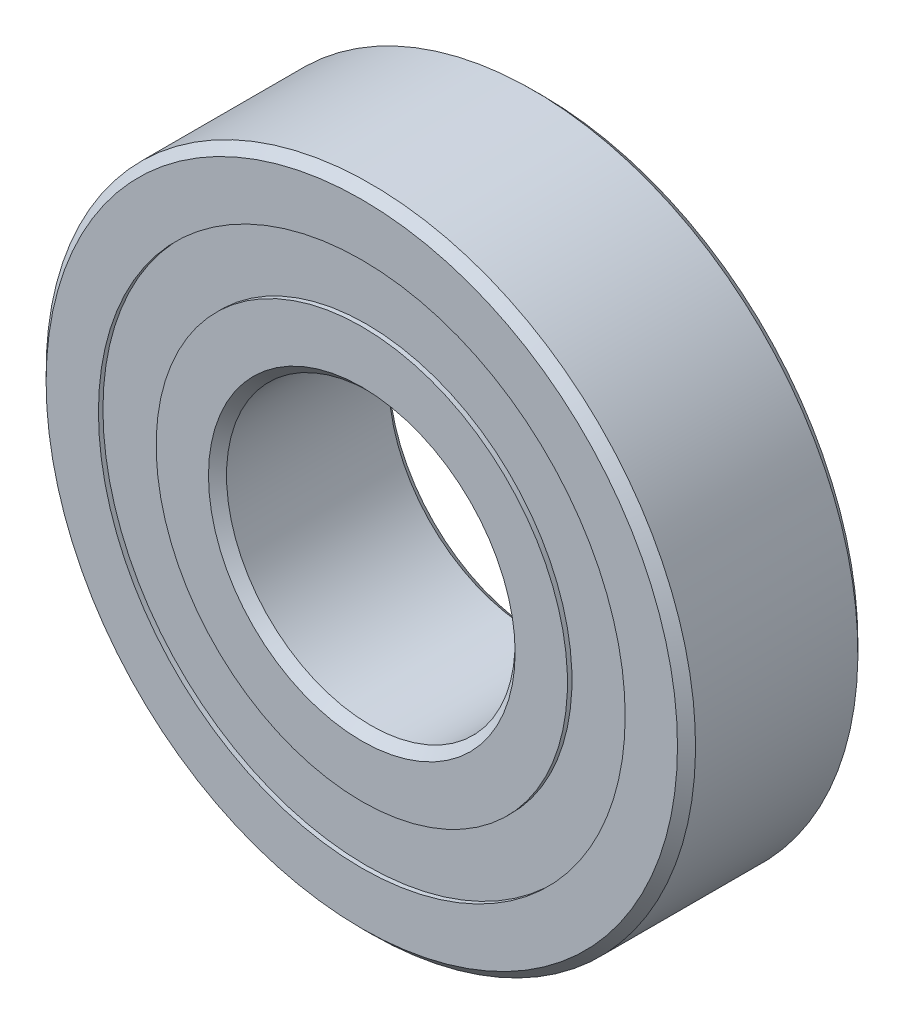
ISO-10303-21;
HEADER;
FILE_DESCRIPTION(('STEP AP214'),'2;1');
FILE_NAME('part.step','',(''),(''),'','','');
FILE_SCHEMA(('AUTOMOTIVE_DESIGN { 1 0 10303 214 1 1 1 1 }'));
ENDSEC;
DATA;
#1=APPLICATION_CONTEXT('core data for automotive mechanical design processes');
#2=APPLICATION_PROTOCOL_DEFINITION('international standard','automotive_design',2000,#1);
#3=PRODUCT_CONTEXT('',#1,'mechanical');
#4=PRODUCT('Part','Part','',(#3));
#5=PRODUCT_RELATED_PRODUCT_CATEGORY('part','',(#4));
#6=PRODUCT_DEFINITION_FORMATION('','',#4);
#7=PRODUCT_DEFINITION_CONTEXT('part definition',#1,'design');
#8=PRODUCT_DEFINITION('design','',#6,#7);
#9=PRODUCT_DEFINITION_SHAPE('','',#8);
#10=(LENGTH_UNIT() NAMED_UNIT(*) SI_UNIT(.MILLI.,.METRE.));
#11=(NAMED_UNIT(*) PLANE_ANGLE_UNIT() SI_UNIT($,.RADIAN.));
#12=(NAMED_UNIT(*) SI_UNIT($,.STERADIAN.) SOLID_ANGLE_UNIT());
#13=UNCERTAINTY_MEASURE_WITH_UNIT(LENGTH_MEASURE(1.E-05),#10,'distance_accuracy_value','');
#14=(GEOMETRIC_REPRESENTATION_CONTEXT(3) GLOBAL_UNCERTAINTY_ASSIGNED_CONTEXT((#13)) GLOBAL_UNIT_ASSIGNED_CONTEXT((#10,
#11,#12)) REPRESENTATION_CONTEXT('',''));
#15=CARTESIAN_POINT('',(0.,0.,0.));
#16=DIRECTION('',(0.,0.,1.));
#17=DIRECTION('',(1.,0.,0.));
#18=AXIS2_PLACEMENT_3D('',#15,#16,#17);
#19=CARTESIAN_POINT('',(0.,11.58875,-3.7703125));
#20=DIRECTION('',(0.,0.,1.));
#21=DIRECTION('',(0.,-1.,0.));
#22=AXIS2_PLACEMENT_3D('',#19,#20,#21);
#23=PLANE('',#22);
#24=CARTESIAN_POINT('',(0.,0.,-3.7703125));
#25=DIRECTION('',(0.,0.,1.));
#26=DIRECTION('',(0.,-1.,0.));
#27=AXIS2_PLACEMENT_3D('',#24,#25,#26);
#28=CIRCLE('',#27,11.58875);
#29=CARTESIAN_POINT('',(0.,-11.58875,-3.7703125));
#30=VERTEX_POINT('',#29);
#31=EDGE_CURVE('E69',#30,#30,#28,.T.);
#32=ORIENTED_EDGE('',*,*,#31,.F.);
#33=EDGE_LOOP('',(#32));
#34=FACE_BOUND('',#33,.T.);
#35=CARTESIAN_POINT('',(0.,0.,-3.7703125));
#36=DIRECTION('',(0.,0.,1.));
#37=DIRECTION('',(0.,-1.,0.));
#38=AXIS2_PLACEMENT_3D('',#35,#36,#37);
#39=CIRCLE('',#38,9.04875);
#40=CARTESIAN_POINT('',(0.,-9.04875,-3.7703125));
#41=VERTEX_POINT('',#40);
#42=EDGE_CURVE('E11',#41,#41,#39,.T.);
#43=ORIENTED_EDGE('',*,*,#42,.T.);
#44=EDGE_LOOP('',(#43));
#45=FACE_BOUND('',#44,.T.);
#46=ADVANCED_FACE('F50',(#34,#45),#23,.F.);
#47=CARTESIAN_POINT('',(0.,0.,3.96875));
#48=DIRECTION('',(0.,0.,1.));
#49=DIRECTION('',(0.,-1.,0.));
#50=AXIS2_PLACEMENT_3D('',#47,#48,#49);
#51=CYLINDRICAL_SURFACE('',#50,9.04875);
#52=ORIENTED_EDGE('',*,*,#42,.F.);
#53=EDGE_LOOP('',(#52));
#54=FACE_BOUND('',#53,.T.);
#55=CARTESIAN_POINT('',(0.,0.,-2.1735234096613));
#56=DIRECTION('',(0.,0.,1.));
#57=DIRECTION('',(0.,-1.,0.));
#58=AXIS2_PLACEMENT_3D('',#55,#56,#57);
#59=CIRCLE('',#58,9.04875);
#60=CARTESIAN_POINT('',(0.,-9.04875,-2.1735234096613));
#61=VERTEX_POINT('',#60);
#62=EDGE_CURVE('E57',#61,#61,#59,.T.);
#63=ORIENTED_EDGE('',*,*,#62,.T.);
#64=EDGE_LOOP('',(#63));
#65=FACE_BOUND('',#64,.T.);
#66=ADVANCED_FACE('F80',(#54,#65),#51,.F.);
#67=CARTESIAN_POINT('',(0.,11.58875,-2.1735234096613));
#68=DIRECTION('',(0.,0.,-1.));
#69=DIRECTION('',(0.,1.,0.));
#70=AXIS2_PLACEMENT_3D('',#67,#68,#69);
#71=PLANE('',#70);
#72=ORIENTED_EDGE('',*,*,#62,.F.);
#73=EDGE_LOOP('',(#72));
#74=FACE_BOUND('',#73,.T.);
#75=CARTESIAN_POINT('',(0.,0.,-2.1735234096613));
#76=DIRECTION('',(0.,0.,1.));
#77=DIRECTION('',(0.,-1.,0.));
#78=AXIS2_PLACEMENT_3D('',#75,#76,#77);
#79=CIRCLE('',#78,11.58875);
#80=CARTESIAN_POINT('',(0.,-11.58875,-2.1735234096613));
#81=VERTEX_POINT('',#80);
#82=EDGE_CURVE('E63',#81,#81,#79,.T.);
#83=ORIENTED_EDGE('',*,*,#82,.T.);
#84=EDGE_LOOP('',(#83));
#85=FACE_BOUND('',#84,.T.);
#86=ADVANCED_FACE('F84',(#74,#85),#71,.F.);
#87=CARTESIAN_POINT('',(0.,0.,3.96875));
#88=DIRECTION('',(0.,0.,1.));
#89=DIRECTION('',(0.,-1.,0.));
#90=AXIS2_PLACEMENT_3D('',#87,#88,#89);
#91=CYLINDRICAL_SURFACE('',#90,11.58875);
#92=ORIENTED_EDGE('',*,*,#82,.F.);
#93=EDGE_LOOP('',(#92));
#94=FACE_BOUND('',#93,.T.);
#95=ORIENTED_EDGE('',*,*,#31,.T.);
#96=EDGE_LOOP('',(#95));
#97=FACE_BOUND('',#96,.T.);
#98=ADVANCED_FACE('F77',(#94,#97),#91,.T.);
#99=CLOSED_SHELL('',(#46,#66,#86,#98));
#100=MANIFOLD_SOLID_BREP('B2',#99);
#101=CARTESIAN_POINT('',(0.,11.58875,3.7703125));
#102=DIRECTION('',(0.,0.,-1.));
#103=DIRECTION('',(0.,1.,0.));
#104=AXIS2_PLACEMENT_3D('',#101,#102,#103);
#105=PLANE('',#104);
#106=CARTESIAN_POINT('',(0.,0.,3.77031249999999));
#107=DIRECTION('',(0.,0.,1.));
#108=DIRECTION('',(0.,-1.,0.));
#109=AXIS2_PLACEMENT_3D('',#106,#107,#108);
#110=CIRCLE('',#109,9.04875);
#111=CARTESIAN_POINT('',(0.,-9.04875,3.77031249999999));
#112=VERTEX_POINT('',#111);
#113=EDGE_CURVE('E49',#112,#112,#110,.T.);
#114=ORIENTED_EDGE('',*,*,#113,.F.);
#115=EDGE_LOOP('',(#114));
#116=FACE_BOUND('',#115,.T.);
#117=CARTESIAN_POINT('',(0.,0.,3.77031249999999));
#118=DIRECTION('',(0.,0.,1.));
#119=DIRECTION('',(0.,-1.,0.));
#120=AXIS2_PLACEMENT_3D('',#117,#118,#119);
#121=CIRCLE('',#120,11.58875);
#122=CARTESIAN_POINT('',(0.,-11.58875,3.77031249999999));
#123=VERTEX_POINT('',#122);
#124=EDGE_CURVE('E145',#123,#123,#121,.T.);
#125=ORIENTED_EDGE('',*,*,#124,.T.);
#126=EDGE_LOOP('',(#125));
#127=FACE_BOUND('',#126,.T.);
#128=ADVANCED_FACE('F126',(#116,#127),#105,.F.);
#129=CARTESIAN_POINT('',(0.,0.,3.96875));
#130=DIRECTION('',(0.,0.,1.));
#131=DIRECTION('',(0.,-1.,0.));
#132=AXIS2_PLACEMENT_3D('',#129,#130,#131);
#133=CYLINDRICAL_SURFACE('',#132,9.04875);
#134=CARTESIAN_POINT('',(0.,0.,2.17352340966129));
#135=DIRECTION('',(0.,0.,1.));
#136=DIRECTION('',(0.,-1.,0.));
#137=AXIS2_PLACEMENT_3D('',#134,#135,#136);
#138=CIRCLE('',#137,9.04875);
#139=CARTESIAN_POINT('',(0.,-9.04875,2.17352340966129));
#140=VERTEX_POINT('',#139);
#141=EDGE_CURVE('E133',#140,#140,#138,.T.);
#142=ORIENTED_EDGE('',*,*,#141,.F.);
#143=EDGE_LOOP('',(#142));
#144=FACE_BOUND('',#143,.T.);
#145=ORIENTED_EDGE('',*,*,#113,.T.);
#146=EDGE_LOOP('',(#145));
#147=FACE_BOUND('',#146,.T.);
#148=ADVANCED_FACE('F162',(#144,#147),#133,.F.);
#149=CARTESIAN_POINT('',(0.,11.58875,2.1735234096613));
#150=DIRECTION('',(0.,0.,1.));
#151=DIRECTION('',(0.,-1.,0.));
#152=AXIS2_PLACEMENT_3D('',#149,#150,#151);
#153=PLANE('',#152);
#154=CARTESIAN_POINT('',(0.,0.,2.17352340966129));
#155=DIRECTION('',(0.,0.,1.));
#156=DIRECTION('',(0.,-1.,0.));
#157=AXIS2_PLACEMENT_3D('',#154,#155,#156);
#158=CIRCLE('',#157,11.58875);
#159=CARTESIAN_POINT('',(0.,-11.58875,2.17352340966129));
#160=VERTEX_POINT('',#159);
#161=EDGE_CURVE('E139',#160,#160,#158,.T.);
#162=ORIENTED_EDGE('',*,*,#161,.F.);
#163=EDGE_LOOP('',(#162));
#164=FACE_BOUND('',#163,.T.);
#165=ORIENTED_EDGE('',*,*,#141,.T.);
#166=EDGE_LOOP('',(#165));
#167=FACE_BOUND('',#166,.T.);
#168=ADVANCED_FACE('F157',(#164,#167),#153,.F.);
#169=CARTESIAN_POINT('',(0.,0.,3.96875));
#170=DIRECTION('',(0.,0.,1.));
#171=DIRECTION('',(0.,-1.,0.));
#172=AXIS2_PLACEMENT_3D('',#169,#170,#171);
#173=CYLINDRICAL_SURFACE('',#172,11.58875);
#174=ORIENTED_EDGE('',*,*,#124,.F.);
#175=EDGE_LOOP('',(#174));
#176=FACE_BOUND('',#175,.T.);
#177=ORIENTED_EDGE('',*,*,#161,.T.);
#178=EDGE_LOOP('',(#177));
#179=FACE_BOUND('',#178,.T.);
#180=ADVANCED_FACE('F154',(#176,#179),#173,.T.);
#181=CLOSED_SHELL('',(#128,#148,#168,#180));
#182=MANIFOLD_SOLID_BREP('B6',#181);
#183=CARTESIAN_POINT('',(-7.2964580983686,7.29645809836878,0.));
#184=DIRECTION('',(0.,0.,1.));
#185=DIRECTION('',(-0.707106781186539,0.707106781186556,0.));
#186=AXIS2_PLACEMENT_3D('',#183,#184,#185);
#187=SPHERICAL_SURFACE('',#186,2.1735234096613);
#188=CARTESIAN_POINT('',(-7.2964580983686,7.29645809836878,2.1735234096613));
#189=VERTEX_POINT('',#188);
#190=VERTEX_LOOP('',#189);
#191=FACE_BOUND('',#190,.T.);
#192=ADVANCED_FACE('F220',(#191),#187,.T.);
#193=CLOSED_SHELL('',(#192));
#194=MANIFOLD_SOLID_BREP('B44',#193);
#195=CARTESIAN_POINT('',(-10.31875,1.08083169195563E-13,0.));
#196=DIRECTION('',(0.,0.,1.));
#197=DIRECTION('',(-1.,0.,0.));
#198=AXIS2_PLACEMENT_3D('',#195,#196,#197);
#199=SPHERICAL_SURFACE('',#198,2.1735234096613);
#200=CARTESIAN_POINT('',(-10.31875,1.07683899422586E-13,2.17352340966129));
#201=VERTEX_POINT('',#200);
#202=VERTEX_LOOP('',#201);
#203=FACE_BOUND('',#202,.T.);
#204=ADVANCED_FACE('F239',(#203),#199,.T.);
#205=CLOSED_SHELL('',(#204));
#206=MANIFOLD_SOLID_BREP('B122',#205);
#207=CARTESIAN_POINT('',(-7.29645809836875,-7.29645809836862,0.));
#208=DIRECTION('',(0.,0.,1.));
#209=DIRECTION('',(-0.707106781186554,-0.707106781186541,0.));
#210=AXIS2_PLACEMENT_3D('',#207,#208,#209);
#211=SPHERICAL_SURFACE('',#210,2.1735234096613);
#212=CARTESIAN_POINT('',(-7.29645809836875,-7.29645809836863,2.17352340966129));
#213=VERTEX_POINT('',#212);
#214=VERTEX_LOOP('',#213);
#215=FACE_BOUND('',#214,.T.);
#216=ADVANCED_FACE('F258',(#215),#211,.T.);
#217=CLOSED_SHELL('',(#216));
#218=MANIFOLD_SOLID_BREP('B216',#217);
#219=CARTESIAN_POINT('',(0.,-10.31875,0.));
#220=DIRECTION('',(0.,0.,1.));
#221=DIRECTION('',(0.,-1.,0.));
#222=AXIS2_PLACEMENT_3D('',#219,#220,#221);
#223=SPHERICAL_SURFACE('',#222,2.1735234096613);
#224=CARTESIAN_POINT('',(0.,-10.31875,2.17352340966129));
#225=VERTEX_POINT('',#224);
#226=VERTEX_LOOP('',#225);
#227=FACE_BOUND('',#226,.T.);
#228=ADVANCED_FACE('F277',(#227),#223,.T.);
#229=CLOSED_SHELL('',(#228));
#230=MANIFOLD_SOLID_BREP('B235',#229);
#231=CARTESIAN_POINT('',(7.29645809836865,-7.29645809836873,0.));
#232=DIRECTION('',(0.,0.,1.));
#233=DIRECTION('',(0.707106781186544,-0.707106781186551,0.));
#234=AXIS2_PLACEMENT_3D('',#231,#232,#233);
#235=SPHERICAL_SURFACE('',#234,2.1735234096613);
#236=CARTESIAN_POINT('',(7.29645809836865,-7.29645809836873,2.17352340966129));
#237=VERTEX_POINT('',#236);
#238=VERTEX_LOOP('',#237);
#239=FACE_BOUND('',#238,.T.);
#240=ADVANCED_FACE('F296',(#239),#235,.T.);
#241=CLOSED_SHELL('',(#240));
#242=MANIFOLD_SOLID_BREP('B254',#241);
#243=CARTESIAN_POINT('',(10.31875,0.,0.));
#244=DIRECTION('',(0.,0.,1.));
#245=DIRECTION('',(1.,0.,0.));
#246=AXIS2_PLACEMENT_3D('',#243,#244,#245);
#247=SPHERICAL_SURFACE('',#246,2.1735234096613);
#248=CARTESIAN_POINT('',(10.31875,0.,2.17352340966129));
#249=VERTEX_POINT('',#248);
#250=VERTEX_LOOP('',#249);
#251=FACE_BOUND('',#250,.T.);
#252=ADVANCED_FACE('F315',(#251),#247,.T.);
#253=CLOSED_SHELL('',(#252));
#254=MANIFOLD_SOLID_BREP('B273',#253);
#255=CARTESIAN_POINT('',(7.2964580983687,7.29645809836868,0.));
#256=DIRECTION('',(0.,0.,1.));
#257=DIRECTION('',(0.707106781186549,0.707106781186546,0.));
#258=AXIS2_PLACEMENT_3D('',#255,#256,#257);
#259=SPHERICAL_SURFACE('',#258,2.1735234096613);
#260=CARTESIAN_POINT('',(7.2964580983687,7.29645809836868,2.1735234096613));
#261=VERTEX_POINT('',#260);
#262=VERTEX_LOOP('',#261);
#263=FACE_BOUND('',#262,.T.);
#264=ADVANCED_FACE('F334',(#263),#259,.T.);
#265=CLOSED_SHELL('',(#264));
#266=MANIFOLD_SOLID_BREP('B292',#265);
#267=CARTESIAN_POINT('',(0.,10.31875,0.));
#268=DIRECTION('',(0.,0.,1.));
#269=DIRECTION('',(0.,1.,0.));
#270=AXIS2_PLACEMENT_3D('',#267,#268,#269);
#271=SPHERICAL_SURFACE('',#270,2.1735234096613);
#272=CARTESIAN_POINT('',(0.,10.31875,2.1735234096613));
#273=VERTEX_POINT('',#272);
#274=VERTEX_LOOP('',#273);
#275=FACE_BOUND('',#274,.T.);
#276=ADVANCED_FACE('F355',(#275),#271,.T.);
#277=CLOSED_SHELL('',(#276));
#278=MANIFOLD_SOLID_BREP('B311',#277);
#279=CARTESIAN_POINT('',(0.,6.746875,3.96875));
#280=DIRECTION('',(0.,0.,-1.));
#281=DIRECTION('',(0.,1.,0.));
#282=AXIS2_PLACEMENT_3D('',#279,#280,#281);
#283=PLANE('',#282);
#284=CARTESIAN_POINT('',(0.,0.,3.96875));
#285=DIRECTION('',(0.,0.,1.));
#286=DIRECTION('',(0.,-1.,0.));
#287=AXIS2_PLACEMENT_3D('',#284,#285,#286);
#288=CIRCLE('',#287,6.746875);
#289=CARTESIAN_POINT('',(0.,-6.746875,3.96875));
#290=VERTEX_POINT('',#289);
#291=EDGE_CURVE('E412',#290,#290,#288,.T.);
#292=ORIENTED_EDGE('',*,*,#291,.F.);
#293=EDGE_LOOP('',(#292));
#294=FACE_BOUND('',#293,.T.);
#295=CARTESIAN_POINT('',(0.,0.,3.96875));
#296=DIRECTION('',(0.,0.,1.));
#297=DIRECTION('',(0.,-1.,0.));
#298=AXIS2_PLACEMENT_3D('',#295,#296,#297);
#299=CIRCLE('',#298,9.04875);
#300=CARTESIAN_POINT('',(0.,-9.04875,3.96875));
#301=VERTEX_POINT('',#300);
#302=EDGE_CURVE('E354',#301,#301,#299,.T.);
#303=ORIENTED_EDGE('',*,*,#302,.T.);
#304=EDGE_LOOP('',(#303));
#305=FACE_BOUND('',#304,.T.);
#306=ADVANCED_FACE('F375',(#294,#305),#283,.F.);
#307=CARTESIAN_POINT('',(0.,0.,3.96875));
#308=DIRECTION('',(0.,0.,1.));
#309=DIRECTION('',(0.,-1.,0.));
#310=AXIS2_PLACEMENT_3D('',#307,#308,#309);
#311=CYLINDRICAL_SURFACE('',#310,9.04875);
#312=ORIENTED_EDGE('',*,*,#302,.F.);
#313=EDGE_LOOP('',(#312));
#314=FACE_BOUND('',#313,.T.);
#315=CARTESIAN_POINT('',(0.,0.,1.76388888888888));
#316=DIRECTION('',(0.,0.,1.));
#317=DIRECTION('',(0.,-1.,0.));
#318=AXIS2_PLACEMENT_3D('',#315,#316,#317);
#319=CIRCLE('',#318,9.04875);
#320=CARTESIAN_POINT('',(0.,-9.04875,1.76388888888888));
#321=VERTEX_POINT('',#320);
#322=EDGE_CURVE('E382',#321,#321,#319,.T.);
#323=ORIENTED_EDGE('',*,*,#322,.T.);
#324=EDGE_LOOP('',(#323));
#325=FACE_BOUND('',#324,.T.);
#326=ADVANCED_FACE('F421',(#314,#325),#311,.T.);
#327=CARTESIAN_POINT('',(0.,0.,0.));
#328=DIRECTION('',(0.,0.,1.));
#329=DIRECTION('',(0.,-1.,0.));
#330=AXIS2_PLACEMENT_3D('',#327,#328,#329);
#331=TOROIDAL_SURFACE('',#330,10.31875,2.1735234096613);
#332=ORIENTED_EDGE('',*,*,#322,.F.);
#333=EDGE_LOOP('',(#332));
#334=FACE_BOUND('',#333,.T.);
#335=CARTESIAN_POINT('',(0.,0.,-1.76388888888889));
#336=DIRECTION('',(0.,0.,1.));
#337=DIRECTION('',(0.,-1.,0.));
#338=AXIS2_PLACEMENT_3D('',#335,#336,#337);
#339=CIRCLE('',#338,9.04875);
#340=CARTESIAN_POINT('',(0.,-9.04875,-1.76388888888889));
#341=VERTEX_POINT('',#340);
#342=EDGE_CURVE('E388',#341,#341,#339,.T.);
#343=ORIENTED_EDGE('',*,*,#342,.T.);
#344=EDGE_LOOP('',(#343));
#345=FACE_BOUND('',#344,.T.);
#346=ADVANCED_FACE('F425',(#334,#345),#331,.F.);
#347=CARTESIAN_POINT('',(0.,0.,3.96875));
#348=DIRECTION('',(0.,0.,1.));
#349=DIRECTION('',(0.,-1.,0.));
#350=AXIS2_PLACEMENT_3D('',#347,#348,#349);
#351=CYLINDRICAL_SURFACE('',#350,9.04875);
#352=ORIENTED_EDGE('',*,*,#342,.F.);
#353=EDGE_LOOP('',(#352));
#354=FACE_BOUND('',#353,.T.);
#355=CARTESIAN_POINT('',(0.,0.,-3.96875000000001));
#356=DIRECTION('',(0.,0.,1.));
#357=DIRECTION('',(0.,-1.,0.));
#358=AXIS2_PLACEMENT_3D('',#355,#356,#357);
#359=CIRCLE('',#358,9.04875);
#360=CARTESIAN_POINT('',(0.,-9.04875,-3.96875000000001));
#361=VERTEX_POINT('',#360);
#362=EDGE_CURVE('E394',#361,#361,#359,.T.);
#363=ORIENTED_EDGE('',*,*,#362,.T.);
#364=EDGE_LOOP('',(#363));
#365=FACE_BOUND('',#364,.T.);
#366=ADVANCED_FACE('F430',(#354,#365),#351,.T.);
#367=CARTESIAN_POINT('',(0.,6.746875,-3.96875));
#368=DIRECTION('',(0.,0.,1.));
#369=DIRECTION('',(0.,-1.,0.));
#370=AXIS2_PLACEMENT_3D('',#367,#368,#369);
#371=PLANE('',#370);
#372=ORIENTED_EDGE('',*,*,#362,.F.);
#373=EDGE_LOOP('',(#372));
#374=FACE_BOUND('',#373,.T.);
#375=CARTESIAN_POINT('',(0.,0.,-3.96875));
#376=DIRECTION('',(0.,0.,1.));
#377=DIRECTION('',(0.,-1.,0.));
#378=AXIS2_PLACEMENT_3D('',#375,#376,#377);
#379=CIRCLE('',#378,6.746875);
#380=CARTESIAN_POINT('',(0.,-6.746875,-3.96875));
#381=VERTEX_POINT('',#380);
#382=EDGE_CURVE('E400',#381,#381,#379,.T.);
#383=ORIENTED_EDGE('',*,*,#382,.T.);
#384=EDGE_LOOP('',(#383));
#385=FACE_BOUND('',#384,.T.);
#386=ADVANCED_FACE('F436',(#374,#385),#371,.F.);
#387=CARTESIAN_POINT('',(0.,0.,-3.571875));
#388=DIRECTION('',(0.,0.,-1.));
#389=DIRECTION('',(0.,1.,0.));
#390=AXIS2_PLACEMENT_3D('',#387,#388,#389);
#391=CONICAL_SURFACE('',#390,6.35,0.785398163397448);
#392=ORIENTED_EDGE('',*,*,#382,.F.);
#393=EDGE_LOOP('',(#392));
#394=FACE_BOUND('',#393,.T.);
#395=CARTESIAN_POINT('',(0.,0.,-3.571875));
#396=DIRECTION('',(0.,0.,1.));
#397=DIRECTION('',(0.,-1.,0.));
#398=AXIS2_PLACEMENT_3D('',#395,#396,#397);
#399=CIRCLE('',#398,6.35);
#400=CARTESIAN_POINT('',(0.,-6.35,-3.571875));
#401=VERTEX_POINT('',#400);
#402=EDGE_CURVE('E404',#401,#401,#399,.T.);
#403=ORIENTED_EDGE('',*,*,#402,.T.);
#404=EDGE_LOOP('',(#403));
#405=FACE_BOUND('',#404,.T.);
#406=ADVANCED_FACE('F440',(#394,#405),#391,.F.);
#407=CARTESIAN_POINT('',(0.,0.,3.96875));
#408=DIRECTION('',(0.,0.,1.));
#409=DIRECTION('',(0.,-1.,0.));
#410=AXIS2_PLACEMENT_3D('',#407,#408,#409);
#411=CYLINDRICAL_SURFACE('',#410,6.35);
#412=ORIENTED_EDGE('',*,*,#402,.F.);
#413=EDGE_LOOP('',(#412));
#414=FACE_BOUND('',#413,.T.);
#415=CARTESIAN_POINT('',(0.,0.,3.571875));
#416=DIRECTION('',(0.,0.,1.));
#417=DIRECTION('',(0.,-1.,0.));
#418=AXIS2_PLACEMENT_3D('',#415,#416,#417);
#419=CIRCLE('',#418,6.35);
#420=CARTESIAN_POINT('',(0.,-6.35,3.571875));
#421=VERTEX_POINT('',#420);
#422=EDGE_CURVE('E408',#421,#421,#419,.T.);
#423=ORIENTED_EDGE('',*,*,#422,.T.);
#424=EDGE_LOOP('',(#423));
#425=FACE_BOUND('',#424,.T.);
#426=ADVANCED_FACE('F444',(#414,#425),#411,.F.);
#427=CARTESIAN_POINT('',(0.,0.,3.96875));
#428=DIRECTION('',(0.,0.,1.));
#429=DIRECTION('',(0.,-1.,0.));
#430=AXIS2_PLACEMENT_3D('',#427,#428,#429);
#431=CONICAL_SURFACE('',#430,6.746875,0.785398163397449);
#432=ORIENTED_EDGE('',*,*,#422,.F.);
#433=EDGE_LOOP('',(#432));
#434=FACE_BOUND('',#433,.T.);
#435=ORIENTED_EDGE('',*,*,#291,.T.);
#436=EDGE_LOOP('',(#435));
#437=FACE_BOUND('',#436,.T.);
#438=ADVANCED_FACE('F418',(#434,#437),#431,.F.);
#439=CLOSED_SHELL('',(#306,#326,#346,#366,#386,#406,#426,#438));
#440=MANIFOLD_SOLID_BREP('B330',#439);
#441=CARTESIAN_POINT('',(0.,0.,3.96875));
#442=DIRECTION('',(0.,0.,1.));
#443=DIRECTION('',(0.,-1.,0.));
#444=AXIS2_PLACEMENT_3D('',#441,#442,#443);
#445=CYLINDRICAL_SURFACE('',#444,14.2875);
#446=CARTESIAN_POINT('',(0.,0.,3.571875));
#447=DIRECTION('',(0.,0.,1.));
#448=DIRECTION('',(0.,-1.,0.));
#449=AXIS2_PLACEMENT_3D('',#446,#447,#448);
#450=CIRCLE('',#449,14.2875);
#451=CARTESIAN_POINT('',(0.,-14.2875,3.57187499999999));
#452=VERTEX_POINT('',#451);
#453=EDGE_CURVE('E374',#452,#452,#450,.T.);
#454=ORIENTED_EDGE('',*,*,#453,.F.);
#455=EDGE_LOOP('',(#454));
#456=FACE_BOUND('',#455,.T.);
#457=CARTESIAN_POINT('',(0.,0.,-3.571875));
#458=DIRECTION('',(0.,0.,1.));
#459=DIRECTION('',(0.,-1.,0.));
#460=AXIS2_PLACEMENT_3D('',#457,#458,#459);
#461=CIRCLE('',#460,14.2875);
#462=CARTESIAN_POINT('',(0.,-14.2875,-3.57187500000001));
#463=VERTEX_POINT('',#462);
#464=EDGE_CURVE('E550',#463,#463,#461,.T.);
#465=ORIENTED_EDGE('',*,*,#464,.T.);
#466=EDGE_LOOP('',(#465));
#467=FACE_BOUND('',#466,.T.);
#468=ADVANCED_FACE('F513',(#456,#467),#445,.T.);
#469=CARTESIAN_POINT('',(0.,0.,3.571875));
#470=DIRECTION('',(0.,0.,-1.));
#471=DIRECTION('',(0.,1.,0.));
#472=AXIS2_PLACEMENT_3D('',#469,#470,#471);
#473=CONICAL_SURFACE('',#472,14.2875,0.785398163397452);
#474=CARTESIAN_POINT('',(0.,0.,3.96875));
#475=DIRECTION('',(0.,0.,1.));
#476=DIRECTION('',(0.,-1.,0.));
#477=AXIS2_PLACEMENT_3D('',#474,#475,#476);
#478=CIRCLE('',#477,13.890625);
#479=CARTESIAN_POINT('',(0.,-13.890625,3.96874999999999));
#480=VERTEX_POINT('',#479);
#481=EDGE_CURVE('E520',#480,#480,#478,.T.);
#482=ORIENTED_EDGE('',*,*,#481,.F.);
#483=EDGE_LOOP('',(#482));
#484=FACE_BOUND('',#483,.T.);
#485=ORIENTED_EDGE('',*,*,#453,.T.);
#486=EDGE_LOOP('',(#485));
#487=FACE_BOUND('',#486,.T.);
#488=ADVANCED_FACE('F589',(#484,#487),#473,.T.);
#489=CARTESIAN_POINT('',(0.,13.890625,3.96875));
#490=DIRECTION('',(0.,0.,-1.));
#491=DIRECTION('',(0.,1.,0.));
#492=AXIS2_PLACEMENT_3D('',#489,#490,#491);
#493=PLANE('',#492);
#494=CARTESIAN_POINT('',(0.,0.,3.96875));
#495=DIRECTION('',(0.,0.,1.));
#496=DIRECTION('',(0.,-1.,0.));
#497=AXIS2_PLACEMENT_3D('',#494,#495,#496);
#498=CIRCLE('',#497,11.58875);
#499=CARTESIAN_POINT('',(0.,-11.58875,3.96875));
#500=VERTEX_POINT('',#499);
#501=EDGE_CURVE('E526',#500,#500,#498,.T.);
#502=ORIENTED_EDGE('',*,*,#501,.F.);
#503=EDGE_LOOP('',(#502));
#504=FACE_BOUND('',#503,.T.);
#505=ORIENTED_EDGE('',*,*,#481,.T.);
#506=EDGE_LOOP('',(#505));
#507=FACE_BOUND('',#506,.T.);
#508=ADVANCED_FACE('F584',(#504,#507),#493,.F.);
#509=CARTESIAN_POINT('',(0.,0.,3.96875));
#510=DIRECTION('',(0.,0.,1.));
#511=DIRECTION('',(0.,-1.,0.));
#512=AXIS2_PLACEMENT_3D('',#509,#510,#511);
#513=CYLINDRICAL_SURFACE('',#512,11.58875);
#514=CARTESIAN_POINT('',(0.,0.,1.76388888888889));
#515=DIRECTION('',(0.,0.,1.));
#516=DIRECTION('',(0.,-1.,0.));
#517=AXIS2_PLACEMENT_3D('',#514,#515,#516);
#518=CIRCLE('',#517,11.58875);
#519=CARTESIAN_POINT('',(0.,-11.58875,1.76388888888888));
#520=VERTEX_POINT('',#519);
#521=EDGE_CURVE('E532',#520,#520,#518,.T.);
#522=ORIENTED_EDGE('',*,*,#521,.F.);
#523=EDGE_LOOP('',(#522));
#524=FACE_BOUND('',#523,.T.);
#525=ORIENTED_EDGE('',*,*,#501,.T.);
#526=EDGE_LOOP('',(#525));
#527=FACE_BOUND('',#526,.T.);
#528=ADVANCED_FACE('F578',(#524,#527),#513,.F.);
#529=CARTESIAN_POINT('',(0.,0.,0.));
#530=DIRECTION('',(0.,0.,1.));
#531=DIRECTION('',(0.,-1.,0.));
#532=AXIS2_PLACEMENT_3D('',#529,#530,#531);
#533=TOROIDAL_SURFACE('',#532,10.31875,2.1735234096613);
#534=CARTESIAN_POINT('',(0.,0.,-1.76388888888889));
#535=DIRECTION('',(0.,0.,1.));
#536=DIRECTION('',(0.,-1.,0.));
#537=AXIS2_PLACEMENT_3D('',#534,#535,#536);
#538=CIRCLE('',#537,11.58875);
#539=CARTESIAN_POINT('',(0.,-11.58875,-1.76388888888889));
#540=VERTEX_POINT('',#539);
#541=EDGE_CURVE('E538',#540,#540,#538,.T.);
#542=ORIENTED_EDGE('',*,*,#541,.F.);
#543=EDGE_LOOP('',(#542));
#544=FACE_BOUND('',#543,.T.);
#545=ORIENTED_EDGE('',*,*,#521,.T.);
#546=EDGE_LOOP('',(#545));
#547=FACE_BOUND('',#546,.T.);
#548=ADVANCED_FACE('F572',(#544,#547),#533,.F.);
#549=CARTESIAN_POINT('',(0.,0.,3.96875));
#550=DIRECTION('',(0.,0.,1.));
#551=DIRECTION('',(0.,-1.,0.));
#552=AXIS2_PLACEMENT_3D('',#549,#550,#551);
#553=CYLINDRICAL_SURFACE('',#552,11.58875);
#554=CARTESIAN_POINT('',(0.,0.,-3.96875));
#555=DIRECTION('',(0.,0.,1.));
#556=DIRECTION('',(0.,-1.,0.));
#557=AXIS2_PLACEMENT_3D('',#554,#555,#556);
#558=CIRCLE('',#557,11.58875);
#559=CARTESIAN_POINT('',(0.,-11.58875,-3.96875));
#560=VERTEX_POINT('',#559);
#561=EDGE_CURVE('E542',#560,#560,#558,.T.);
#562=ORIENTED_EDGE('',*,*,#561,.F.);
#563=EDGE_LOOP('',(#562));
#564=FACE_BOUND('',#563,.T.);
#565=ORIENTED_EDGE('',*,*,#541,.T.);
#566=EDGE_LOOP('',(#565));
#567=FACE_BOUND('',#566,.T.);
#568=ADVANCED_FACE('F566',(#564,#567),#553,.F.);
#569=CARTESIAN_POINT('',(0.,13.890625,-3.96875));
#570=DIRECTION('',(0.,0.,1.));
#571=DIRECTION('',(0.,-1.,0.));
#572=AXIS2_PLACEMENT_3D('',#569,#570,#571);
#573=PLANE('',#572);
#574=CARTESIAN_POINT('',(0.,0.,-3.96875));
#575=DIRECTION('',(0.,0.,1.));
#576=DIRECTION('',(0.,-1.,0.));
#577=AXIS2_PLACEMENT_3D('',#574,#575,#576);
#578=CIRCLE('',#577,13.890625);
#579=CARTESIAN_POINT('',(0.,-13.890625,-3.96875));
#580=VERTEX_POINT('',#579);
#581=EDGE_CURVE('E546',#580,#580,#578,.T.);
#582=ORIENTED_EDGE('',*,*,#581,.F.);
#583=EDGE_LOOP('',(#582));
#584=FACE_BOUND('',#583,.T.);
#585=ORIENTED_EDGE('',*,*,#561,.T.);
#586=EDGE_LOOP('',(#585));
#587=FACE_BOUND('',#586,.T.);
#588=ADVANCED_FACE('F560',(#584,#587),#573,.F.);
#589=CARTESIAN_POINT('',(0.,0.,-3.96875));
#590=DIRECTION('',(0.,0.,1.));
#591=DIRECTION('',(0.,-1.,0.));
#592=AXIS2_PLACEMENT_3D('',#589,#590,#591);
#593=CONICAL_SURFACE('',#592,13.890625,0.785398163397454);
#594=ORIENTED_EDGE('',*,*,#464,.F.);
#595=EDGE_LOOP('',(#594));
#596=FACE_BOUND('',#595,.T.);
#597=ORIENTED_EDGE('',*,*,#581,.T.);
#598=EDGE_LOOP('',(#597));
#599=FACE_BOUND('',#598,.T.);
#600=ADVANCED_FACE('F557',(#596,#599),#593,.T.);
#601=CLOSED_SHELL('',(#468,#488,#508,#528,#548,#568,#588,#600));
#602=MANIFOLD_SOLID_BREP('B349',#601);
#603=ADVANCED_BREP_SHAPE_REPRESENTATION('',(#18,#100,#182,#194,#206,#218,#230,#242,#254,#266,
#278,#440,#602),#14);
#604=SHAPE_DEFINITION_REPRESENTATION(#9,#603);
ENDSEC;
END-ISO-10303-21;
